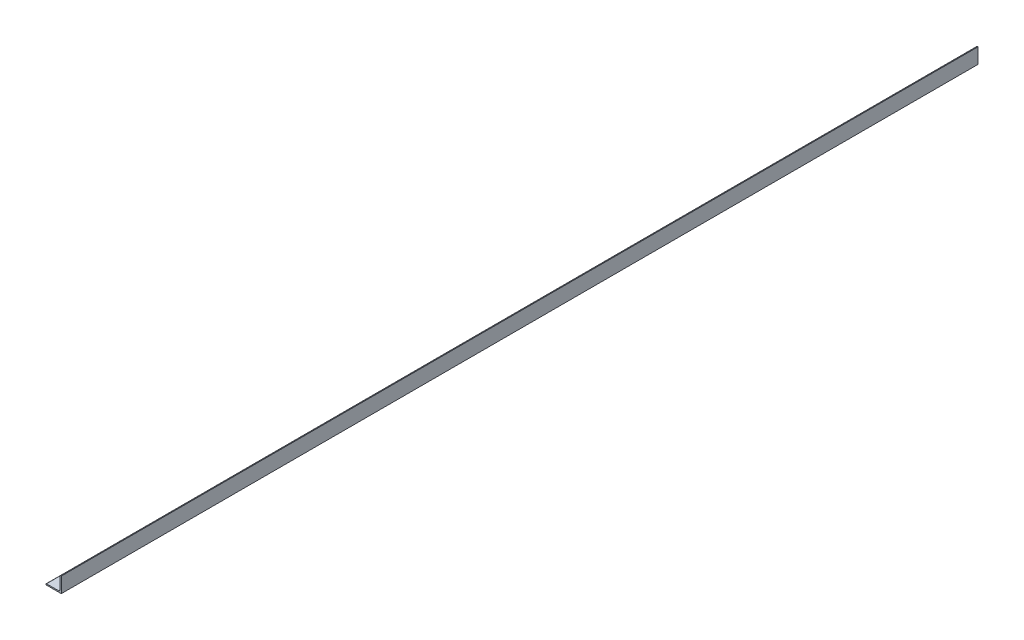
ISO-10303-21;
HEADER;
FILE_DESCRIPTION(('STEP AP214'),'2;1');
FILE_NAME('part.step','',(''),(''),'','','');
FILE_SCHEMA(('AUTOMOTIVE_DESIGN { 1 0 10303 214 1 1 1 1 }'));
ENDSEC;
DATA;
#1=APPLICATION_CONTEXT('core data for automotive mechanical design processes');
#2=APPLICATION_PROTOCOL_DEFINITION('international standard','automotive_design',2000,#1);
#3=PRODUCT_CONTEXT('',#1,'mechanical');
#4=PRODUCT('Part','Part','',(#3));
#5=PRODUCT_RELATED_PRODUCT_CATEGORY('part','',(#4));
#6=PRODUCT_DEFINITION_FORMATION('','',#4);
#7=PRODUCT_DEFINITION_CONTEXT('part definition',#1,'design');
#8=PRODUCT_DEFINITION('design','',#6,#7);
#9=PRODUCT_DEFINITION_SHAPE('','',#8);
#10=(LENGTH_UNIT() NAMED_UNIT(*) SI_UNIT(.MILLI.,.METRE.));
#11=(NAMED_UNIT(*) PLANE_ANGLE_UNIT() SI_UNIT($,.RADIAN.));
#12=(NAMED_UNIT(*) SI_UNIT($,.STERADIAN.) SOLID_ANGLE_UNIT());
#13=UNCERTAINTY_MEASURE_WITH_UNIT(LENGTH_MEASURE(1.E-05),#10,'distance_accuracy_value','');
#14=(GEOMETRIC_REPRESENTATION_CONTEXT(3) GLOBAL_UNCERTAINTY_ASSIGNED_CONTEXT((#13)) GLOBAL_UNIT_ASSIGNED_CONTEXT((#10,
#11,#12)) REPRESENTATION_CONTEXT('',''));
#15=CARTESIAN_POINT('',(0.,0.,0.));
#16=DIRECTION('',(0.,0.,1.));
#17=DIRECTION('',(1.,0.,0.));
#18=AXIS2_PLACEMENT_3D('',#15,#16,#17);
#19=CARTESIAN_POINT('',(-50.,0.,-1500.));
#20=DIRECTION('',(0.,1.,0.));
#21=DIRECTION('',(-1.,0.,0.));
#22=AXIS2_PLACEMENT_3D('',#19,#20,#21);
#23=PLANE('',#22);
#24=DIRECTION('',(-1.,0.,0.));
#25=VECTOR('',#24,1.);
#26=CARTESIAN_POINT('',(-50.,0.,1500.));
#27=LINE('',#26,#25);
#28=CARTESIAN_POINT('',(0.,0.,1500.));
#29=VERTEX_POINT('',#28);
#30=CARTESIAN_POINT('',(-50.,0.,1500.));
#31=VERTEX_POINT('',#30);
#32=EDGE_CURVE('E151',#29,#31,#27,.T.);
#33=ORIENTED_EDGE('',*,*,#32,.T.);
#34=DIRECTION('',(0.,0.,1.));
#35=VECTOR('',#34,1.);
#36=CARTESIAN_POINT('',(-50.,0.,-1500.));
#37=LINE('',#36,#35);
#38=CARTESIAN_POINT('',(-50.,0.,-1500.));
#39=VERTEX_POINT('',#38);
#40=EDGE_CURVE('E11',#39,#31,#37,.T.);
#41=ORIENTED_EDGE('',*,*,#40,.F.);
#42=DIRECTION('',(-1.,0.,0.));
#43=VECTOR('',#42,1.);
#44=CARTESIAN_POINT('',(-50.,0.,-1500.));
#45=LINE('',#44,#43);
#46=CARTESIAN_POINT('',(0.,0.,-1500.));
#47=VERTEX_POINT('',#46);
#48=EDGE_CURVE('E176',#47,#39,#45,.T.);
#49=ORIENTED_EDGE('',*,*,#48,.F.);
#50=DIRECTION('',(0.,0.,1.));
#51=VECTOR('',#50,1.);
#52=CARTESIAN_POINT('',(0.,0.,-1500.));
#53=LINE('',#52,#51);
#54=EDGE_CURVE('E147',#47,#29,#53,.T.);
#55=ORIENTED_EDGE('',*,*,#54,.T.);
#56=EDGE_LOOP('',(#33,#41,#49,#55));
#57=FACE_BOUND('',#56,.T.);
#58=ADVANCED_FACE('F43',(#57),#23,.F.);
#59=CARTESIAN_POINT('',(-50.,2.19999999999999,-1500.));
#60=DIRECTION('',(1.,0.,0.));
#61=DIRECTION('',(0.,0.,-1.));
#62=AXIS2_PLACEMENT_3D('',#59,#60,#61);
#63=PLANE('',#62);
#64=DIRECTION('',(0.,1.,0.));
#65=VECTOR('',#64,1.);
#66=CARTESIAN_POINT('',(-50.,2.19999999999999,1500.));
#67=LINE('',#66,#65);
#68=CARTESIAN_POINT('',(-50.,2.19999999999999,1500.));
#69=VERTEX_POINT('',#68);
#70=EDGE_CURVE('E155',#31,#69,#67,.T.);
#71=ORIENTED_EDGE('',*,*,#70,.T.);
#72=DIRECTION('',(0.,0.,1.));
#73=VECTOR('',#72,1.);
#74=CARTESIAN_POINT('',(-50.,2.19999999999999,-1500.));
#75=LINE('',#74,#73);
#76=CARTESIAN_POINT('',(-50.,2.19999999999999,-1500.));
#77=VERTEX_POINT('',#76);
#78=EDGE_CURVE('E52',#77,#69,#75,.T.);
#79=ORIENTED_EDGE('',*,*,#78,.F.);
#80=DIRECTION('',(0.,1.,0.));
#81=VECTOR('',#80,1.);
#82=CARTESIAN_POINT('',(-50.,2.19999999999999,-1500.));
#83=LINE('',#82,#81);
#84=EDGE_CURVE('E106',#39,#77,#83,.T.);
#85=ORIENTED_EDGE('',*,*,#84,.F.);
#86=ORIENTED_EDGE('',*,*,#40,.T.);
#87=EDGE_LOOP('',(#71,#79,#85,#86));
#88=FACE_BOUND('',#87,.T.);
#89=ADVANCED_FACE('F235',(#88),#63,.F.);
#90=CARTESIAN_POINT('',(-48.2,2.2,-1500.));
#91=DIRECTION('',(0.,0.,1.));
#92=DIRECTION('',(1.,0.,0.));
#93=AXIS2_PLACEMENT_3D('',#90,#91,#92);
#94=CYLINDRICAL_SURFACE('',#93,1.8);
#95=CARTESIAN_POINT('',(-48.2,2.2,1500.));
#96=DIRECTION('',(0.,0.,-1.));
#97=DIRECTION('',(1.,0.,0.));
#98=AXIS2_PLACEMENT_3D('',#95,#96,#97);
#99=CIRCLE('',#98,1.8);
#100=CARTESIAN_POINT('',(-48.2,4.,1500.));
#101=VERTEX_POINT('',#100);
#102=EDGE_CURVE('E158',#69,#101,#99,.T.);
#103=ORIENTED_EDGE('',*,*,#102,.T.);
#104=DIRECTION('',(0.,0.,1.));
#105=VECTOR('',#104,1.);
#106=CARTESIAN_POINT('',(-48.2,4.,-1500.));
#107=LINE('',#106,#105);
#108=CARTESIAN_POINT('',(-48.2,4.,-1500.));
#109=VERTEX_POINT('',#108);
#110=EDGE_CURVE('E191',#109,#101,#107,.T.);
#111=ORIENTED_EDGE('',*,*,#110,.F.);
#112=CARTESIAN_POINT('',(-48.2,2.2,-1500.));
#113=DIRECTION('',(0.,0.,-1.));
#114=DIRECTION('',(1.,0.,0.));
#115=AXIS2_PLACEMENT_3D('',#112,#113,#114);
#116=CIRCLE('',#115,1.8);
#117=EDGE_CURVE('E202',#77,#109,#116,.T.);
#118=ORIENTED_EDGE('',*,*,#117,.F.);
#119=ORIENTED_EDGE('',*,*,#78,.T.);
#120=EDGE_LOOP('',(#103,#111,#118,#119));
#121=FACE_BOUND('',#120,.T.);
#122=ADVANCED_FACE('F200',(#121),#94,.T.);
#123=CARTESIAN_POINT('',(-9.50000000000004,4.,-1500.));
#124=DIRECTION('',(0.,-1.,0.));
#125=DIRECTION('',(1.,0.,0.));
#126=AXIS2_PLACEMENT_3D('',#123,#124,#125);
#127=PLANE('',#126);
#128=DIRECTION('',(1.,0.,0.));
#129=VECTOR('',#128,1.);
#130=CARTESIAN_POINT('',(-9.50000000000004,4.,1500.));
#131=LINE('',#130,#129);
#132=CARTESIAN_POINT('',(-9.50000000000004,4.,1500.));
#133=VERTEX_POINT('',#132);
#134=EDGE_CURVE('E161',#101,#133,#131,.T.);
#135=ORIENTED_EDGE('',*,*,#134,.T.);
#136=DIRECTION('',(0.,0.,1.));
#137=VECTOR('',#136,1.);
#138=CARTESIAN_POINT('',(-9.50000000000004,4.,-1500.));
#139=LINE('',#138,#137);
#140=CARTESIAN_POINT('',(-9.50000000000004,4.,-1500.));
#141=VERTEX_POINT('',#140);
#142=EDGE_CURVE('E187',#141,#133,#139,.T.);
#143=ORIENTED_EDGE('',*,*,#142,.F.);
#144=DIRECTION('',(1.,0.,0.));
#145=VECTOR('',#144,1.);
#146=CARTESIAN_POINT('',(-9.50000000000004,4.,-1500.));
#147=LINE('',#146,#145);
#148=EDGE_CURVE('E219',#109,#141,#147,.T.);
#149=ORIENTED_EDGE('',*,*,#148,.F.);
#150=ORIENTED_EDGE('',*,*,#110,.T.);
#151=EDGE_LOOP('',(#135,#143,#149,#150));
#152=FACE_BOUND('',#151,.T.);
#153=ADVANCED_FACE('F211',(#152),#127,.F.);
#154=CARTESIAN_POINT('',(-9.5,9.5,-1500.));
#155=DIRECTION('',(0.,0.,1.));
#156=DIRECTION('',(1.,0.,0.));
#157=AXIS2_PLACEMENT_3D('',#154,#155,#156);
#158=CYLINDRICAL_SURFACE('',#157,5.5);
#159=CARTESIAN_POINT('',(-9.5,9.5,1500.));
#160=DIRECTION('',(0.,0.,1.));
#161=DIRECTION('',(-1.,0.,0.));
#162=AXIS2_PLACEMENT_3D('',#159,#160,#161);
#163=CIRCLE('',#162,5.5);
#164=CARTESIAN_POINT('',(-4.,9.50000000000004,1500.));
#165=VERTEX_POINT('',#164);
#166=EDGE_CURVE('E164',#133,#165,#163,.T.);
#167=ORIENTED_EDGE('',*,*,#166,.T.);
#168=DIRECTION('',(0.,0.,1.));
#169=VECTOR('',#168,1.);
#170=CARTESIAN_POINT('',(-4.,9.50000000000004,-1500.));
#171=LINE('',#170,#169);
#172=CARTESIAN_POINT('',(-4.,9.50000000000004,-1500.));
#173=VERTEX_POINT('',#172);
#174=EDGE_CURVE('E183',#173,#165,#171,.T.);
#175=ORIENTED_EDGE('',*,*,#174,.F.);
#176=CARTESIAN_POINT('',(-9.5,9.5,-1500.));
#177=DIRECTION('',(0.,0.,1.));
#178=DIRECTION('',(-1.,0.,0.));
#179=AXIS2_PLACEMENT_3D('',#176,#177,#178);
#180=CIRCLE('',#179,5.5);
#181=EDGE_CURVE('E217',#141,#173,#180,.T.);
#182=ORIENTED_EDGE('',*,*,#181,.F.);
#183=ORIENTED_EDGE('',*,*,#142,.T.);
#184=EDGE_LOOP('',(#167,#175,#182,#183));
#185=FACE_BOUND('',#184,.T.);
#186=ADVANCED_FACE('F215',(#185),#158,.F.);
#187=CARTESIAN_POINT('',(-4.,48.2,-1500.));
#188=DIRECTION('',(1.,0.,0.));
#189=DIRECTION('',(0.,1.,0.));
#190=AXIS2_PLACEMENT_3D('',#187,#188,#189);
#191=PLANE('',#190);
#192=DIRECTION('',(0.,1.,0.));
#193=VECTOR('',#192,1.);
#194=CARTESIAN_POINT('',(-4.,48.2,1500.));
#195=LINE('',#194,#193);
#196=CARTESIAN_POINT('',(-4.,48.2,1500.));
#197=VERTEX_POINT('',#196);
#198=EDGE_CURVE('E167',#165,#197,#195,.T.);
#199=ORIENTED_EDGE('',*,*,#198,.T.);
#200=DIRECTION('',(0.,0.,1.));
#201=VECTOR('',#200,1.);
#202=CARTESIAN_POINT('',(-4.,48.2,-1500.));
#203=LINE('',#202,#201);
#204=CARTESIAN_POINT('',(-4.,48.2,-1500.));
#205=VERTEX_POINT('',#204);
#206=EDGE_CURVE('E139',#205,#197,#203,.T.);
#207=ORIENTED_EDGE('',*,*,#206,.F.);
#208=DIRECTION('',(0.,1.,0.));
#209=VECTOR('',#208,1.);
#210=CARTESIAN_POINT('',(-4.,48.2,-1500.));
#211=LINE('',#210,#209);
#212=EDGE_CURVE('E128',#173,#205,#211,.T.);
#213=ORIENTED_EDGE('',*,*,#212,.F.);
#214=ORIENTED_EDGE('',*,*,#174,.T.);
#215=EDGE_LOOP('',(#199,#207,#213,#214));
#216=FACE_BOUND('',#215,.T.);
#217=ADVANCED_FACE('F247',(#216),#191,.F.);
#218=CARTESIAN_POINT('',(-2.2,48.2,-1500.));
#219=DIRECTION('',(0.,0.,1.));
#220=DIRECTION('',(1.,0.,0.));
#221=AXIS2_PLACEMENT_3D('',#218,#219,#220);
#222=CYLINDRICAL_SURFACE('',#221,1.8);
#223=CARTESIAN_POINT('',(-2.2,48.2,1500.));
#224=DIRECTION('',(0.,0.,-1.));
#225=DIRECTION('',(1.,0.,0.));
#226=AXIS2_PLACEMENT_3D('',#223,#224,#225);
#227=CIRCLE('',#226,1.8);
#228=CARTESIAN_POINT('',(-2.19999999999999,50.,1500.));
#229=VERTEX_POINT('',#228);
#230=EDGE_CURVE('E137',#197,#229,#227,.T.);
#231=ORIENTED_EDGE('',*,*,#230,.T.);
#232=DIRECTION('',(0.,0.,1.));
#233=VECTOR('',#232,1.);
#234=CARTESIAN_POINT('',(-2.19999999999999,50.,-1500.));
#235=LINE('',#234,#233);
#236=CARTESIAN_POINT('',(-2.19999999999999,50.,-1500.));
#237=VERTEX_POINT('',#236);
#238=EDGE_CURVE('E134',#237,#229,#235,.T.);
#239=ORIENTED_EDGE('',*,*,#238,.F.);
#240=CARTESIAN_POINT('',(-2.2,48.2,-1500.));
#241=DIRECTION('',(0.,0.,-1.));
#242=DIRECTION('',(1.,0.,0.));
#243=AXIS2_PLACEMENT_3D('',#240,#241,#242);
#244=CIRCLE('',#243,1.8);
#245=EDGE_CURVE('E122',#205,#237,#244,.T.);
#246=ORIENTED_EDGE('',*,*,#245,.F.);
#247=ORIENTED_EDGE('',*,*,#206,.T.);
#248=EDGE_LOOP('',(#231,#239,#246,#247));
#249=FACE_BOUND('',#248,.T.);
#250=ADVANCED_FACE('F135',(#249),#222,.T.);
#251=CARTESIAN_POINT('',(0.,50.,-1500.));
#252=DIRECTION('',(0.,-1.,0.));
#253=DIRECTION('',(1.,0.,0.));
#254=AXIS2_PLACEMENT_3D('',#251,#252,#253);
#255=PLANE('',#254);
#256=DIRECTION('',(1.,0.,0.));
#257=VECTOR('',#256,1.);
#258=CARTESIAN_POINT('',(0.,50.,1500.));
#259=LINE('',#258,#257);
#260=CARTESIAN_POINT('',(0.,50.,1500.));
#261=VERTEX_POINT('',#260);
#262=EDGE_CURVE('E92',#229,#261,#259,.T.);
#263=ORIENTED_EDGE('',*,*,#262,.T.);
#264=DIRECTION('',(0.,0.,1.));
#265=VECTOR('',#264,1.);
#266=CARTESIAN_POINT('',(0.,50.,-1500.));
#267=LINE('',#266,#265);
#268=CARTESIAN_POINT('',(0.,50.,-1500.));
#269=VERTEX_POINT('',#268);
#270=EDGE_CURVE('E140',#269,#261,#267,.T.);
#271=ORIENTED_EDGE('',*,*,#270,.F.);
#272=DIRECTION('',(1.,0.,0.));
#273=VECTOR('',#272,1.);
#274=CARTESIAN_POINT('',(0.,50.,-1500.));
#275=LINE('',#274,#273);
#276=EDGE_CURVE('E126',#237,#269,#275,.T.);
#277=ORIENTED_EDGE('',*,*,#276,.F.);
#278=ORIENTED_EDGE('',*,*,#238,.T.);
#279=EDGE_LOOP('',(#263,#271,#277,#278));
#280=FACE_BOUND('',#279,.T.);
#281=ADVANCED_FACE('F142',(#280),#255,.F.);
#282=CARTESIAN_POINT('',(0.,0.,-1500.));
#283=DIRECTION('',(-1.,0.,0.));
#284=DIRECTION('',(0.,0.,1.));
#285=AXIS2_PLACEMENT_3D('',#282,#283,#284);
#286=PLANE('',#285);
#287=DIRECTION('',(0.,-1.,0.));
#288=VECTOR('',#287,1.);
#289=CARTESIAN_POINT('',(0.,0.,1500.));
#290=LINE('',#289,#288);
#291=EDGE_CURVE('E98',#261,#29,#290,.T.);
#292=ORIENTED_EDGE('',*,*,#291,.T.);
#293=ORIENTED_EDGE('',*,*,#54,.F.);
#294=DIRECTION('',(0.,-1.,0.));
#295=VECTOR('',#294,1.);
#296=CARTESIAN_POINT('',(0.,0.,-1500.));
#297=LINE('',#296,#295);
#298=EDGE_CURVE('E60',#269,#47,#297,.T.);
#299=ORIENTED_EDGE('',*,*,#298,.F.);
#300=ORIENTED_EDGE('',*,*,#270,.T.);
#301=EDGE_LOOP('',(#292,#293,#299,#300));
#302=FACE_BOUND('',#301,.T.);
#303=ADVANCED_FACE('F255',(#302),#286,.F.);
#304=CARTESIAN_POINT('',(-2.2,48.2,-1500.));
#305=DIRECTION('',(0.,0.,1.));
#306=DIRECTION('',(1.,0.,0.));
#307=AXIS2_PLACEMENT_3D('',#304,#305,#306);
#308=PLANE('',#307);
#309=ORIENTED_EDGE('',*,*,#48,.T.);
#310=ORIENTED_EDGE('',*,*,#84,.T.);
#311=ORIENTED_EDGE('',*,*,#117,.T.);
#312=ORIENTED_EDGE('',*,*,#148,.T.);
#313=ORIENTED_EDGE('',*,*,#181,.T.);
#314=ORIENTED_EDGE('',*,*,#212,.T.);
#315=ORIENTED_EDGE('',*,*,#245,.T.);
#316=ORIENTED_EDGE('',*,*,#276,.T.);
#317=ORIENTED_EDGE('',*,*,#298,.T.);
#318=EDGE_LOOP('',(#309,#310,#311,#312,#313,#314,#315,#316,#317));
#319=FACE_BOUND('',#318,.T.);
#320=ADVANCED_FACE('F124',(#319),#308,.F.);
#321=CARTESIAN_POINT('',(-2.2,48.2,1500.));
#322=DIRECTION('',(0.,0.,1.));
#323=DIRECTION('',(1.,0.,0.));
#324=AXIS2_PLACEMENT_3D('',#321,#322,#323);
#325=PLANE('',#324);
#326=ORIENTED_EDGE('',*,*,#32,.F.);
#327=ORIENTED_EDGE('',*,*,#291,.F.);
#328=ORIENTED_EDGE('',*,*,#262,.F.);
#329=ORIENTED_EDGE('',*,*,#230,.F.);
#330=ORIENTED_EDGE('',*,*,#198,.F.);
#331=ORIENTED_EDGE('',*,*,#166,.F.);
#332=ORIENTED_EDGE('',*,*,#134,.F.);
#333=ORIENTED_EDGE('',*,*,#102,.F.);
#334=ORIENTED_EDGE('',*,*,#70,.F.);
#335=EDGE_LOOP('',(#326,#327,#328,#329,#330,#331,#332,#333,#334));
#336=FACE_BOUND('',#335,.T.);
#337=ADVANCED_FACE('F206',(#336),#325,.T.);
#338=CLOSED_SHELL('',(#58,#89,#122,#153,#186,#217,#250,#281,#303,#320,#337));
#339=MANIFOLD_SOLID_BREP('B2',#338);
#340=ADVANCED_BREP_SHAPE_REPRESENTATION('',(#18,#339),#14);
#341=SHAPE_DEFINITION_REPRESENTATION(#9,#340);
ENDSEC;
END-ISO-10303-21;
